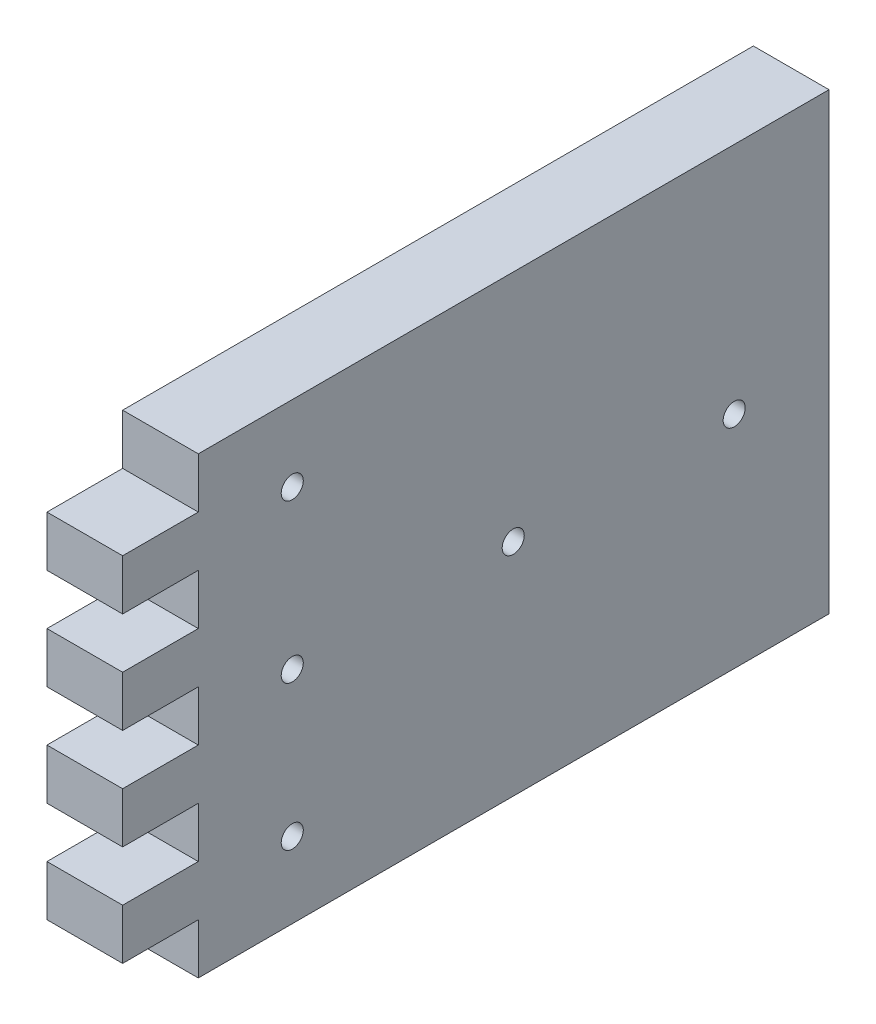
ISO-10303-21;
HEADER;
FILE_DESCRIPTION(('STEP AP214'),'2;1');
FILE_NAME('part.step','',(''),(''),'','','');
FILE_SCHEMA(('AUTOMOTIVE_DESIGN { 1 0 10303 214 1 1 1 1 }'));
ENDSEC;
DATA;
#1=APPLICATION_CONTEXT('core data for automotive mechanical design processes');
#2=APPLICATION_PROTOCOL_DEFINITION('international standard','automotive_design',2000,#1);
#3=PRODUCT_CONTEXT('',#1,'mechanical');
#4=PRODUCT('Part','Part','',(#3));
#5=PRODUCT_RELATED_PRODUCT_CATEGORY('part','',(#4));
#6=PRODUCT_DEFINITION_FORMATION('','',#4);
#7=PRODUCT_DEFINITION_CONTEXT('part definition',#1,'design');
#8=PRODUCT_DEFINITION('design','',#6,#7);
#9=PRODUCT_DEFINITION_SHAPE('','',#8);
#10=(LENGTH_UNIT() NAMED_UNIT(*) SI_UNIT(.MILLI.,.METRE.));
#11=(NAMED_UNIT(*) PLANE_ANGLE_UNIT() SI_UNIT($,.RADIAN.));
#12=(NAMED_UNIT(*) SI_UNIT($,.STERADIAN.) SOLID_ANGLE_UNIT());
#13=UNCERTAINTY_MEASURE_WITH_UNIT(LENGTH_MEASURE(1.E-05),#10,'distance_accuracy_value','');
#14=(GEOMETRIC_REPRESENTATION_CONTEXT(3) GLOBAL_UNCERTAINTY_ASSIGNED_CONTEXT((#13)) GLOBAL_UNIT_ASSIGNED_CONTEXT((#10,
#11,#12)) REPRESENTATION_CONTEXT('',''));
#15=CARTESIAN_POINT('',(0.,0.,0.));
#16=DIRECTION('',(0.,0.,1.));
#17=DIRECTION('',(1.,0.,0.));
#18=AXIS2_PLACEMENT_3D('',#15,#16,#17);
#19=CARTESIAN_POINT('',(19.05,114.3,-177.8635));
#20=DIRECTION('',(0.,0.,1.));
#21=DIRECTION('',(0.,-1.,0.));
#22=AXIS2_PLACEMENT_3D('',#19,#20,#21);
#23=PLANE('',#22);
#24=DIRECTION('',(0.,1.,0.));
#25=VECTOR('',#24,1.);
#26=CARTESIAN_POINT('',(0.,114.3,-177.8635));
#27=LINE('',#26,#25);
#28=CARTESIAN_POINT('',(0.,0.,-177.8635));
#29=VERTEX_POINT('',#28);
#30=CARTESIAN_POINT('',(0.,114.3,-177.8635));
#31=VERTEX_POINT('',#30);
#32=EDGE_CURVE('E203',#29,#31,#27,.T.);
#33=ORIENTED_EDGE('',*,*,#32,.T.);
#34=DIRECTION('',(-1.,0.,0.));
#35=VECTOR('',#34,1.);
#36=CARTESIAN_POINT('',(19.05,114.3,-177.8635));
#37=LINE('',#36,#35);
#38=CARTESIAN_POINT('',(19.05,114.3,-177.8635));
#39=VERTEX_POINT('',#38);
#40=EDGE_CURVE('E11',#39,#31,#37,.T.);
#41=ORIENTED_EDGE('',*,*,#40,.F.);
#42=DIRECTION('',(0.,1.,0.));
#43=VECTOR('',#42,1.);
#44=CARTESIAN_POINT('',(19.05,114.3,-177.8635));
#45=LINE('',#44,#43);
#46=CARTESIAN_POINT('',(19.05,0.,-177.8635));
#47=VERTEX_POINT('',#46);
#48=EDGE_CURVE('E242',#47,#39,#45,.T.);
#49=ORIENTED_EDGE('',*,*,#48,.F.);
#50=DIRECTION('',(-1.,0.,0.));
#51=VECTOR('',#50,1.);
#52=CARTESIAN_POINT('',(19.05,0.,-177.8635));
#53=LINE('',#52,#51);
#54=EDGE_CURVE('E199',#47,#29,#53,.T.);
#55=ORIENTED_EDGE('',*,*,#54,.T.);
#56=EDGE_LOOP('',(#33,#41,#49,#55));
#57=FACE_BOUND('',#56,.T.);
#58=ADVANCED_FACE('F35',(#57),#23,.F.);
#59=CARTESIAN_POINT('',(19.05,114.3,-19.05));
#60=DIRECTION('',(0.,-1.,0.));
#61=DIRECTION('',(0.,0.,-1.));
#62=AXIS2_PLACEMENT_3D('',#59,#60,#61);
#63=PLANE('',#62);
#64=DIRECTION('',(0.,0.,1.));
#65=VECTOR('',#64,1.);
#66=CARTESIAN_POINT('',(0.,114.3,-19.05));
#67=LINE('',#66,#65);
#68=CARTESIAN_POINT('',(0.,114.3,-19.05));
#69=VERTEX_POINT('',#68);
#70=EDGE_CURVE('E206',#31,#69,#67,.T.);
#71=ORIENTED_EDGE('',*,*,#70,.T.);
#72=DIRECTION('',(-1.,0.,0.));
#73=VECTOR('',#72,1.);
#74=CARTESIAN_POINT('',(19.05,114.3,-19.05));
#75=LINE('',#74,#73);
#76=CARTESIAN_POINT('',(19.05,114.3,-19.05));
#77=VERTEX_POINT('',#76);
#78=EDGE_CURVE('E43',#77,#69,#75,.T.);
#79=ORIENTED_EDGE('',*,*,#78,.F.);
#80=DIRECTION('',(0.,0.,1.));
#81=VECTOR('',#80,1.);
#82=CARTESIAN_POINT('',(19.05,114.3,-19.05));
#83=LINE('',#82,#81);
#84=EDGE_CURVE('E130',#39,#77,#83,.T.);
#85=ORIENTED_EDGE('',*,*,#84,.F.);
#86=ORIENTED_EDGE('',*,*,#40,.T.);
#87=EDGE_LOOP('',(#71,#79,#85,#86));
#88=FACE_BOUND('',#87,.T.);
#89=ADVANCED_FACE('F361',(#88),#63,.F.);
#90=CARTESIAN_POINT('',(19.05,114.3,-19.05));
#91=DIRECTION('',(0.,0.,-1.));
#92=DIRECTION('',(-1.,0.,0.));
#93=AXIS2_PLACEMENT_3D('',#90,#91,#92);
#94=PLANE('',#93);
#95=DIRECTION('',(0.,-1.,0.));
#96=VECTOR('',#95,1.);
#97=CARTESIAN_POINT('',(0.,114.3,-19.05));
#98=LINE('',#97,#96);
#99=CARTESIAN_POINT('',(0.,101.6,-19.05));
#100=VERTEX_POINT('',#99);
#101=EDGE_CURVE('E209',#69,#100,#98,.T.);
#102=ORIENTED_EDGE('',*,*,#101,.T.);
#103=DIRECTION('',(-1.,0.,0.));
#104=VECTOR('',#103,1.);
#105=CARTESIAN_POINT('',(19.05,101.6,-19.05));
#106=LINE('',#105,#104);
#107=CARTESIAN_POINT('',(19.05,101.6,-19.05));
#108=VERTEX_POINT('',#107);
#109=EDGE_CURVE('E285',#108,#100,#106,.T.);
#110=ORIENTED_EDGE('',*,*,#109,.F.);
#111=DIRECTION('',(0.,-1.,0.));
#112=VECTOR('',#111,1.);
#113=CARTESIAN_POINT('',(19.05,114.3,-19.05));
#114=LINE('',#113,#112);
#115=EDGE_CURVE('E293',#77,#108,#114,.T.);
#116=ORIENTED_EDGE('',*,*,#115,.F.);
#117=ORIENTED_EDGE('',*,*,#78,.T.);
#118=EDGE_LOOP('',(#102,#110,#116,#117));
#119=FACE_BOUND('',#118,.T.);
#120=ADVANCED_FACE('F291',(#119),#94,.F.);
#121=CARTESIAN_POINT('',(19.05,101.6,0.));
#122=DIRECTION('',(0.,-1.,0.));
#123=DIRECTION('',(0.,0.,-1.));
#124=AXIS2_PLACEMENT_3D('',#121,#122,#123);
#125=PLANE('',#124);
#126=DIRECTION('',(0.,0.,1.));
#127=VECTOR('',#126,1.);
#128=CARTESIAN_POINT('',(0.,101.6,0.));
#129=LINE('',#128,#127);
#130=CARTESIAN_POINT('',(0.,101.6,0.));
#131=VERTEX_POINT('',#130);
#132=EDGE_CURVE('E211',#100,#131,#129,.T.);
#133=ORIENTED_EDGE('',*,*,#132,.T.);
#134=DIRECTION('',(-1.,0.,0.));
#135=VECTOR('',#134,1.);
#136=CARTESIAN_POINT('',(19.05,101.6,0.));
#137=LINE('',#136,#135);
#138=CARTESIAN_POINT('',(19.05,101.6,0.));
#139=VERTEX_POINT('',#138);
#140=EDGE_CURVE('E282',#139,#131,#137,.T.);
#141=ORIENTED_EDGE('',*,*,#140,.F.);
#142=DIRECTION('',(0.,0.,1.));
#143=VECTOR('',#142,1.);
#144=CARTESIAN_POINT('',(19.05,101.6,0.));
#145=LINE('',#144,#143);
#146=EDGE_CURVE('E311',#108,#139,#145,.T.);
#147=ORIENTED_EDGE('',*,*,#146,.F.);
#148=ORIENTED_EDGE('',*,*,#109,.T.);
#149=EDGE_LOOP('',(#133,#141,#147,#148));
#150=FACE_BOUND('',#149,.T.);
#151=ADVANCED_FACE('F302',(#150),#125,.F.);
#152=CARTESIAN_POINT('',(19.05,88.9,0.));
#153=DIRECTION('',(0.,0.,-1.));
#154=DIRECTION('',(-1.,0.,0.));
#155=AXIS2_PLACEMENT_3D('',#152,#153,#154);
#156=PLANE('',#155);
#157=DIRECTION('',(0.,-1.,0.));
#158=VECTOR('',#157,1.);
#159=CARTESIAN_POINT('',(0.,88.9,0.));
#160=LINE('',#159,#158);
#161=CARTESIAN_POINT('',(0.,88.9,0.));
#162=VERTEX_POINT('',#161);
#163=EDGE_CURVE('E213',#131,#162,#160,.T.);
#164=ORIENTED_EDGE('',*,*,#163,.T.);
#165=DIRECTION('',(-1.,0.,0.));
#166=VECTOR('',#165,1.);
#167=CARTESIAN_POINT('',(19.05,88.9,0.));
#168=LINE('',#167,#166);
#169=CARTESIAN_POINT('',(19.05,88.9,0.));
#170=VERTEX_POINT('',#169);
#171=EDGE_CURVE('E279',#170,#162,#168,.T.);
#172=ORIENTED_EDGE('',*,*,#171,.F.);
#173=DIRECTION('',(0.,-1.,0.));
#174=VECTOR('',#173,1.);
#175=CARTESIAN_POINT('',(19.05,88.9,0.));
#176=LINE('',#175,#174);
#177=EDGE_CURVE('E308',#139,#170,#176,.T.);
#178=ORIENTED_EDGE('',*,*,#177,.F.);
#179=ORIENTED_EDGE('',*,*,#140,.T.);
#180=EDGE_LOOP('',(#164,#172,#178,#179));
#181=FACE_BOUND('',#180,.T.);
#182=ADVANCED_FACE('F306',(#181),#156,.F.);
#183=CARTESIAN_POINT('',(19.05,88.9,0.));
#184=DIRECTION('',(0.,1.,0.));
#185=DIRECTION('',(0.,0.,1.));
#186=AXIS2_PLACEMENT_3D('',#183,#184,#185);
#187=PLANE('',#186);
#188=DIRECTION('',(0.,0.,-1.));
#189=VECTOR('',#188,1.);
#190=CARTESIAN_POINT('',(0.,88.9,0.));
#191=LINE('',#190,#189);
#192=CARTESIAN_POINT('',(0.,88.9,-19.05));
#193=VERTEX_POINT('',#192);
#194=EDGE_CURVE('E215',#162,#193,#191,.T.);
#195=ORIENTED_EDGE('',*,*,#194,.T.);
#196=DIRECTION('',(-1.,0.,0.));
#197=VECTOR('',#196,1.);
#198=CARTESIAN_POINT('',(19.05,88.9,-19.05));
#199=LINE('',#198,#197);
#200=CARTESIAN_POINT('',(19.05,88.9,-19.05));
#201=VERTEX_POINT('',#200);
#202=EDGE_CURVE('E276',#201,#193,#199,.T.);
#203=ORIENTED_EDGE('',*,*,#202,.F.);
#204=DIRECTION('',(0.,0.,-1.));
#205=VECTOR('',#204,1.);
#206=CARTESIAN_POINT('',(19.05,88.9,0.));
#207=LINE('',#206,#205);
#208=EDGE_CURVE('E310',#170,#201,#207,.T.);
#209=ORIENTED_EDGE('',*,*,#208,.F.);
#210=ORIENTED_EDGE('',*,*,#171,.T.);
#211=EDGE_LOOP('',(#195,#203,#209,#210));
#212=FACE_BOUND('',#211,.T.);
#213=ADVANCED_FACE('F374',(#212),#187,.F.);
#214=CARTESIAN_POINT('',(19.05,88.9,-19.05));
#215=DIRECTION('',(0.,0.,-1.));
#216=DIRECTION('',(-1.,0.,0.));
#217=AXIS2_PLACEMENT_3D('',#214,#215,#216);
#218=PLANE('',#217);
#219=DIRECTION('',(0.,-1.,0.));
#220=VECTOR('',#219,1.);
#221=CARTESIAN_POINT('',(0.,88.9,-19.05));
#222=LINE('',#221,#220);
#223=CARTESIAN_POINT('',(0.,76.2,-19.05));
#224=VERTEX_POINT('',#223);
#225=EDGE_CURVE('E217',#193,#224,#222,.T.);
#226=ORIENTED_EDGE('',*,*,#225,.T.);
#227=DIRECTION('',(-1.,0.,0.));
#228=VECTOR('',#227,1.);
#229=CARTESIAN_POINT('',(19.05,76.2,-19.05));
#230=LINE('',#229,#228);
#231=CARTESIAN_POINT('',(19.05,76.2,-19.05));
#232=VERTEX_POINT('',#231);
#233=EDGE_CURVE('E273',#232,#224,#230,.T.);
#234=ORIENTED_EDGE('',*,*,#233,.F.);
#235=DIRECTION('',(0.,-1.,0.));
#236=VECTOR('',#235,1.);
#237=CARTESIAN_POINT('',(19.05,88.9,-19.05));
#238=LINE('',#237,#236);
#239=EDGE_CURVE('E313',#201,#232,#238,.T.);
#240=ORIENTED_EDGE('',*,*,#239,.F.);
#241=ORIENTED_EDGE('',*,*,#202,.T.);
#242=EDGE_LOOP('',(#226,#234,#240,#241));
#243=FACE_BOUND('',#242,.T.);
#244=ADVANCED_FACE('F377',(#243),#218,.F.);
#245=CARTESIAN_POINT('',(19.05,76.2,0.));
#246=DIRECTION('',(0.,-1.,0.));
#247=DIRECTION('',(0.,0.,-1.));
#248=AXIS2_PLACEMENT_3D('',#245,#246,#247);
#249=PLANE('',#248);
#250=DIRECTION('',(0.,0.,1.));
#251=VECTOR('',#250,1.);
#252=CARTESIAN_POINT('',(0.,76.2,0.));
#253=LINE('',#252,#251);
#254=CARTESIAN_POINT('',(0.,76.2,0.));
#255=VERTEX_POINT('',#254);
#256=EDGE_CURVE('E219',#224,#255,#253,.T.);
#257=ORIENTED_EDGE('',*,*,#256,.T.);
#258=DIRECTION('',(-1.,0.,0.));
#259=VECTOR('',#258,1.);
#260=CARTESIAN_POINT('',(19.05,76.2,0.));
#261=LINE('',#260,#259);
#262=CARTESIAN_POINT('',(19.05,76.2,0.));
#263=VERTEX_POINT('',#262);
#264=EDGE_CURVE('E270',#263,#255,#261,.T.);
#265=ORIENTED_EDGE('',*,*,#264,.F.);
#266=DIRECTION('',(0.,0.,1.));
#267=VECTOR('',#266,1.);
#268=CARTESIAN_POINT('',(19.05,76.2,0.));
#269=LINE('',#268,#267);
#270=EDGE_CURVE('E319',#232,#263,#269,.T.);
#271=ORIENTED_EDGE('',*,*,#270,.F.);
#272=ORIENTED_EDGE('',*,*,#233,.T.);
#273=EDGE_LOOP('',(#257,#265,#271,#272));
#274=FACE_BOUND('',#273,.T.);
#275=ADVANCED_FACE('F381',(#274),#249,.F.);
#276=CARTESIAN_POINT('',(19.05,63.5,0.));
#277=DIRECTION('',(0.,0.,-1.));
#278=DIRECTION('',(-1.,0.,0.));
#279=AXIS2_PLACEMENT_3D('',#276,#277,#278);
#280=PLANE('',#279);
#281=DIRECTION('',(0.,-1.,0.));
#282=VECTOR('',#281,1.);
#283=CARTESIAN_POINT('',(0.,63.5,0.));
#284=LINE('',#283,#282);
#285=CARTESIAN_POINT('',(0.,63.5,0.));
#286=VERTEX_POINT('',#285);
#287=EDGE_CURVE('E221',#255,#286,#284,.T.);
#288=ORIENTED_EDGE('',*,*,#287,.T.);
#289=DIRECTION('',(-1.,0.,0.));
#290=VECTOR('',#289,1.);
#291=CARTESIAN_POINT('',(19.05,63.5,0.));
#292=LINE('',#291,#290);
#293=CARTESIAN_POINT('',(19.05,63.5,0.));
#294=VERTEX_POINT('',#293);
#295=EDGE_CURVE('E267',#294,#286,#292,.T.);
#296=ORIENTED_EDGE('',*,*,#295,.F.);
#297=DIRECTION('',(0.,-1.,0.));
#298=VECTOR('',#297,1.);
#299=CARTESIAN_POINT('',(19.05,63.5,0.));
#300=LINE('',#299,#298);
#301=EDGE_CURVE('E321',#263,#294,#300,.T.);
#302=ORIENTED_EDGE('',*,*,#301,.F.);
#303=ORIENTED_EDGE('',*,*,#264,.T.);
#304=EDGE_LOOP('',(#288,#296,#302,#303));
#305=FACE_BOUND('',#304,.T.);
#306=ADVANCED_FACE('F385',(#305),#280,.F.);
#307=CARTESIAN_POINT('',(19.05,63.5,0.));
#308=DIRECTION('',(0.,1.,0.));
#309=DIRECTION('',(0.,0.,1.));
#310=AXIS2_PLACEMENT_3D('',#307,#308,#309);
#311=PLANE('',#310);
#312=DIRECTION('',(0.,0.,-1.));
#313=VECTOR('',#312,1.);
#314=CARTESIAN_POINT('',(0.,63.5,0.));
#315=LINE('',#314,#313);
#316=CARTESIAN_POINT('',(0.,63.5,-19.05));
#317=VERTEX_POINT('',#316);
#318=EDGE_CURVE('E223',#286,#317,#315,.T.);
#319=ORIENTED_EDGE('',*,*,#318,.T.);
#320=DIRECTION('',(-1.,0.,0.));
#321=VECTOR('',#320,1.);
#322=CARTESIAN_POINT('',(19.05,63.5,-19.05));
#323=LINE('',#322,#321);
#324=CARTESIAN_POINT('',(19.05,63.5,-19.05));
#325=VERTEX_POINT('',#324);
#326=EDGE_CURVE('E264',#325,#317,#323,.T.);
#327=ORIENTED_EDGE('',*,*,#326,.F.);
#328=DIRECTION('',(0.,0.,-1.));
#329=VECTOR('',#328,1.);
#330=CARTESIAN_POINT('',(19.05,63.5,0.));
#331=LINE('',#330,#329);
#332=EDGE_CURVE('E323',#294,#325,#331,.T.);
#333=ORIENTED_EDGE('',*,*,#332,.F.);
#334=ORIENTED_EDGE('',*,*,#295,.T.);
#335=EDGE_LOOP('',(#319,#327,#333,#334));
#336=FACE_BOUND('',#335,.T.);
#337=ADVANCED_FACE('F389',(#336),#311,.F.);
#338=CARTESIAN_POINT('',(19.05,63.5,-19.05));
#339=DIRECTION('',(0.,0.,-1.));
#340=DIRECTION('',(-1.,0.,0.));
#341=AXIS2_PLACEMENT_3D('',#338,#339,#340);
#342=PLANE('',#341);
#343=DIRECTION('',(0.,-1.,0.));
#344=VECTOR('',#343,1.);
#345=CARTESIAN_POINT('',(0.,63.5,-19.05));
#346=LINE('',#345,#344);
#347=CARTESIAN_POINT('',(0.,50.8,-19.05));
#348=VERTEX_POINT('',#347);
#349=EDGE_CURVE('E225',#317,#348,#346,.T.);
#350=ORIENTED_EDGE('',*,*,#349,.T.);
#351=DIRECTION('',(-1.,0.,0.));
#352=VECTOR('',#351,1.);
#353=CARTESIAN_POINT('',(19.05,50.8,-19.05));
#354=LINE('',#353,#352);
#355=CARTESIAN_POINT('',(19.05,50.8,-19.05));
#356=VERTEX_POINT('',#355);
#357=EDGE_CURVE('E261',#356,#348,#354,.T.);
#358=ORIENTED_EDGE('',*,*,#357,.F.);
#359=DIRECTION('',(0.,-1.,0.));
#360=VECTOR('',#359,1.);
#361=CARTESIAN_POINT('',(19.05,63.5,-19.05));
#362=LINE('',#361,#360);
#363=EDGE_CURVE('E325',#325,#356,#362,.T.);
#364=ORIENTED_EDGE('',*,*,#363,.F.);
#365=ORIENTED_EDGE('',*,*,#326,.T.);
#366=EDGE_LOOP('',(#350,#358,#364,#365));
#367=FACE_BOUND('',#366,.T.);
#368=ADVANCED_FACE('F393',(#367),#342,.F.);
#369=CARTESIAN_POINT('',(19.05,50.8,0.));
#370=DIRECTION('',(0.,-1.,0.));
#371=DIRECTION('',(0.,0.,-1.));
#372=AXIS2_PLACEMENT_3D('',#369,#370,#371);
#373=PLANE('',#372);
#374=DIRECTION('',(0.,0.,1.));
#375=VECTOR('',#374,1.);
#376=CARTESIAN_POINT('',(0.,50.8,0.));
#377=LINE('',#376,#375);
#378=CARTESIAN_POINT('',(0.,50.8,0.));
#379=VERTEX_POINT('',#378);
#380=EDGE_CURVE('E227',#348,#379,#377,.T.);
#381=ORIENTED_EDGE('',*,*,#380,.T.);
#382=DIRECTION('',(-1.,0.,0.));
#383=VECTOR('',#382,1.);
#384=CARTESIAN_POINT('',(19.05,50.8,0.));
#385=LINE('',#384,#383);
#386=CARTESIAN_POINT('',(19.05,50.8,0.));
#387=VERTEX_POINT('',#386);
#388=EDGE_CURVE('E258',#387,#379,#385,.T.);
#389=ORIENTED_EDGE('',*,*,#388,.F.);
#390=DIRECTION('',(0.,0.,1.));
#391=VECTOR('',#390,1.);
#392=CARTESIAN_POINT('',(19.05,50.8,0.));
#393=LINE('',#392,#391);
#394=EDGE_CURVE('E327',#356,#387,#393,.T.);
#395=ORIENTED_EDGE('',*,*,#394,.F.);
#396=ORIENTED_EDGE('',*,*,#357,.T.);
#397=EDGE_LOOP('',(#381,#389,#395,#396));
#398=FACE_BOUND('',#397,.T.);
#399=ADVANCED_FACE('F397',(#398),#373,.F.);
#400=CARTESIAN_POINT('',(19.05,38.1,0.));
#401=DIRECTION('',(0.,0.,-1.));
#402=DIRECTION('',(-1.,0.,0.));
#403=AXIS2_PLACEMENT_3D('',#400,#401,#402);
#404=PLANE('',#403);
#405=DIRECTION('',(0.,-1.,0.));
#406=VECTOR('',#405,1.);
#407=CARTESIAN_POINT('',(0.,38.1,0.));
#408=LINE('',#407,#406);
#409=CARTESIAN_POINT('',(0.,38.1,0.));
#410=VERTEX_POINT('',#409);
#411=EDGE_CURVE('E229',#379,#410,#408,.T.);
#412=ORIENTED_EDGE('',*,*,#411,.T.);
#413=DIRECTION('',(-1.,0.,0.));
#414=VECTOR('',#413,1.);
#415=CARTESIAN_POINT('',(19.05,38.1,0.));
#416=LINE('',#415,#414);
#417=CARTESIAN_POINT('',(19.05,38.1,0.));
#418=VERTEX_POINT('',#417);
#419=EDGE_CURVE('E255',#418,#410,#416,.T.);
#420=ORIENTED_EDGE('',*,*,#419,.F.);
#421=DIRECTION('',(0.,-1.,0.));
#422=VECTOR('',#421,1.);
#423=CARTESIAN_POINT('',(19.05,38.1,0.));
#424=LINE('',#423,#422);
#425=EDGE_CURVE('E329',#387,#418,#424,.T.);
#426=ORIENTED_EDGE('',*,*,#425,.F.);
#427=ORIENTED_EDGE('',*,*,#388,.T.);
#428=EDGE_LOOP('',(#412,#420,#426,#427));
#429=FACE_BOUND('',#428,.T.);
#430=ADVANCED_FACE('F401',(#429),#404,.F.);
#431=CARTESIAN_POINT('',(19.05,38.1,0.));
#432=DIRECTION('',(0.,1.,0.));
#433=DIRECTION('',(0.,0.,1.));
#434=AXIS2_PLACEMENT_3D('',#431,#432,#433);
#435=PLANE('',#434);
#436=DIRECTION('',(0.,0.,-1.));
#437=VECTOR('',#436,1.);
#438=CARTESIAN_POINT('',(0.,38.1,0.));
#439=LINE('',#438,#437);
#440=CARTESIAN_POINT('',(0.,38.1,-19.05));
#441=VERTEX_POINT('',#440);
#442=EDGE_CURVE('E231',#410,#441,#439,.T.);
#443=ORIENTED_EDGE('',*,*,#442,.T.);
#444=DIRECTION('',(-1.,0.,0.));
#445=VECTOR('',#444,1.);
#446=CARTESIAN_POINT('',(19.05,38.1,-19.05));
#447=LINE('',#446,#445);
#448=CARTESIAN_POINT('',(19.05,38.1,-19.05));
#449=VERTEX_POINT('',#448);
#450=EDGE_CURVE('E252',#449,#441,#447,.T.);
#451=ORIENTED_EDGE('',*,*,#450,.F.);
#452=DIRECTION('',(0.,0.,-1.));
#453=VECTOR('',#452,1.);
#454=CARTESIAN_POINT('',(19.05,38.1,0.));
#455=LINE('',#454,#453);
#456=EDGE_CURVE('E331',#418,#449,#455,.T.);
#457=ORIENTED_EDGE('',*,*,#456,.F.);
#458=ORIENTED_EDGE('',*,*,#419,.T.);
#459=EDGE_LOOP('',(#443,#451,#457,#458));
#460=FACE_BOUND('',#459,.T.);
#461=ADVANCED_FACE('F405',(#460),#435,.F.);
#462=CARTESIAN_POINT('',(19.05,38.1,-19.05));
#463=DIRECTION('',(0.,0.,-1.));
#464=DIRECTION('',(-1.,0.,0.));
#465=AXIS2_PLACEMENT_3D('',#462,#463,#464);
#466=PLANE('',#465);
#467=DIRECTION('',(0.,-1.,0.));
#468=VECTOR('',#467,1.);
#469=CARTESIAN_POINT('',(0.,38.1,-19.05));
#470=LINE('',#469,#468);
#471=CARTESIAN_POINT('',(0.,25.4,-19.05));
#472=VERTEX_POINT('',#471);
#473=EDGE_CURVE('E233',#441,#472,#470,.T.);
#474=ORIENTED_EDGE('',*,*,#473,.T.);
#475=DIRECTION('',(-1.,0.,0.));
#476=VECTOR('',#475,1.);
#477=CARTESIAN_POINT('',(19.05,25.4,-19.05));
#478=LINE('',#477,#476);
#479=CARTESIAN_POINT('',(19.05,25.4,-19.05));
#480=VERTEX_POINT('',#479);
#481=EDGE_CURVE('E249',#480,#472,#478,.T.);
#482=ORIENTED_EDGE('',*,*,#481,.F.);
#483=DIRECTION('',(0.,-1.,0.));
#484=VECTOR('',#483,1.);
#485=CARTESIAN_POINT('',(19.05,38.1,-19.05));
#486=LINE('',#485,#484);
#487=EDGE_CURVE('E333',#449,#480,#486,.T.);
#488=ORIENTED_EDGE('',*,*,#487,.F.);
#489=ORIENTED_EDGE('',*,*,#450,.T.);
#490=EDGE_LOOP('',(#474,#482,#488,#489));
#491=FACE_BOUND('',#490,.T.);
#492=ADVANCED_FACE('F409',(#491),#466,.F.);
#493=CARTESIAN_POINT('',(19.05,25.4,0.));
#494=DIRECTION('',(0.,-1.,0.));
#495=DIRECTION('',(0.,0.,-1.));
#496=AXIS2_PLACEMENT_3D('',#493,#494,#495);
#497=PLANE('',#496);
#498=DIRECTION('',(0.,0.,1.));
#499=VECTOR('',#498,1.);
#500=CARTESIAN_POINT('',(0.,25.4,0.));
#501=LINE('',#500,#499);
#502=CARTESIAN_POINT('',(0.,25.4,0.));
#503=VERTEX_POINT('',#502);
#504=EDGE_CURVE('E235',#472,#503,#501,.T.);
#505=ORIENTED_EDGE('',*,*,#504,.T.);
#506=DIRECTION('',(-1.,0.,0.));
#507=VECTOR('',#506,1.);
#508=CARTESIAN_POINT('',(19.05,25.4,0.));
#509=LINE('',#508,#507);
#510=CARTESIAN_POINT('',(19.05,25.4,0.));
#511=VERTEX_POINT('',#510);
#512=EDGE_CURVE('E246',#511,#503,#509,.T.);
#513=ORIENTED_EDGE('',*,*,#512,.F.);
#514=DIRECTION('',(0.,0.,1.));
#515=VECTOR('',#514,1.);
#516=CARTESIAN_POINT('',(19.05,25.4,0.));
#517=LINE('',#516,#515);
#518=EDGE_CURVE('E335',#480,#511,#517,.T.);
#519=ORIENTED_EDGE('',*,*,#518,.F.);
#520=ORIENTED_EDGE('',*,*,#481,.T.);
#521=EDGE_LOOP('',(#505,#513,#519,#520));
#522=FACE_BOUND('',#521,.T.);
#523=ADVANCED_FACE('F341',(#522),#497,.F.);
#524=CARTESIAN_POINT('',(19.05,12.7,0.));
#525=DIRECTION('',(0.,0.,-1.));
#526=DIRECTION('',(-1.,0.,0.));
#527=AXIS2_PLACEMENT_3D('',#524,#525,#526);
#528=PLANE('',#527);
#529=DIRECTION('',(0.,-1.,0.));
#530=VECTOR('',#529,1.);
#531=CARTESIAN_POINT('',(0.,12.7,0.));
#532=LINE('',#531,#530);
#533=CARTESIAN_POINT('',(0.,12.7,0.));
#534=VERTEX_POINT('',#533);
#535=EDGE_CURVE('E237',#503,#534,#532,.T.);
#536=ORIENTED_EDGE('',*,*,#535,.T.);
#537=DIRECTION('',(-1.,0.,0.));
#538=VECTOR('',#537,1.);
#539=CARTESIAN_POINT('',(19.05,12.7,0.));
#540=LINE('',#539,#538);
#541=CARTESIAN_POINT('',(19.05,12.7,0.));
#542=VERTEX_POINT('',#541);
#543=EDGE_CURVE('E194',#542,#534,#540,.T.);
#544=ORIENTED_EDGE('',*,*,#543,.F.);
#545=DIRECTION('',(0.,-1.,0.));
#546=VECTOR('',#545,1.);
#547=CARTESIAN_POINT('',(19.05,12.7,0.));
#548=LINE('',#547,#546);
#549=EDGE_CURVE('E185',#511,#542,#548,.T.);
#550=ORIENTED_EDGE('',*,*,#549,.F.);
#551=ORIENTED_EDGE('',*,*,#512,.T.);
#552=EDGE_LOOP('',(#536,#544,#550,#551));
#553=FACE_BOUND('',#552,.T.);
#554=ADVANCED_FACE('F345',(#553),#528,.F.);
#555=CARTESIAN_POINT('',(19.05,12.7,0.));
#556=DIRECTION('',(0.,1.,0.));
#557=DIRECTION('',(0.,0.,1.));
#558=AXIS2_PLACEMENT_3D('',#555,#556,#557);
#559=PLANE('',#558);
#560=DIRECTION('',(0.,0.,-1.));
#561=VECTOR('',#560,1.);
#562=CARTESIAN_POINT('',(0.,12.7,0.));
#563=LINE('',#562,#561);
#564=CARTESIAN_POINT('',(0.,12.7,-19.05));
#565=VERTEX_POINT('',#564);
#566=EDGE_CURVE('E193',#534,#565,#563,.T.);
#567=ORIENTED_EDGE('',*,*,#566,.T.);
#568=DIRECTION('',(-1.,0.,0.));
#569=VECTOR('',#568,1.);
#570=CARTESIAN_POINT('',(19.05,12.7,-19.05));
#571=LINE('',#570,#569);
#572=CARTESIAN_POINT('',(19.05,12.7,-19.05));
#573=VERTEX_POINT('',#572);
#574=EDGE_CURVE('E190',#573,#565,#571,.T.);
#575=ORIENTED_EDGE('',*,*,#574,.F.);
#576=DIRECTION('',(0.,0.,-1.));
#577=VECTOR('',#576,1.);
#578=CARTESIAN_POINT('',(19.05,12.7,0.));
#579=LINE('',#578,#577);
#580=EDGE_CURVE('E179',#542,#573,#579,.T.);
#581=ORIENTED_EDGE('',*,*,#580,.F.);
#582=ORIENTED_EDGE('',*,*,#543,.T.);
#583=EDGE_LOOP('',(#567,#575,#581,#582));
#584=FACE_BOUND('',#583,.T.);
#585=ADVANCED_FACE('F191',(#584),#559,.F.);
#586=CARTESIAN_POINT('',(19.05,0.,-19.05));
#587=DIRECTION('',(0.,0.,-1.));
#588=DIRECTION('',(0.,1.,0.));
#589=AXIS2_PLACEMENT_3D('',#586,#587,#588);
#590=PLANE('',#589);
#591=DIRECTION('',(0.,-1.,0.));
#592=VECTOR('',#591,1.);
#593=CARTESIAN_POINT('',(0.,0.,-19.05));
#594=LINE('',#593,#592);
#595=CARTESIAN_POINT('',(0.,0.,-19.05));
#596=VERTEX_POINT('',#595);
#597=EDGE_CURVE('E116',#565,#596,#594,.T.);
#598=ORIENTED_EDGE('',*,*,#597,.T.);
#599=DIRECTION('',(-1.,0.,0.));
#600=VECTOR('',#599,1.);
#601=CARTESIAN_POINT('',(19.05,0.,-19.05));
#602=LINE('',#601,#600);
#603=CARTESIAN_POINT('',(19.05,0.,-19.05));
#604=VERTEX_POINT('',#603);
#605=EDGE_CURVE('E195',#604,#596,#602,.T.);
#606=ORIENTED_EDGE('',*,*,#605,.F.);
#607=DIRECTION('',(0.,-1.,0.));
#608=VECTOR('',#607,1.);
#609=CARTESIAN_POINT('',(19.05,0.,-19.05));
#610=LINE('',#609,#608);
#611=EDGE_CURVE('E183',#573,#604,#610,.T.);
#612=ORIENTED_EDGE('',*,*,#611,.F.);
#613=ORIENTED_EDGE('',*,*,#574,.T.);
#614=EDGE_LOOP('',(#598,#606,#612,#613));
#615=FACE_BOUND('',#614,.T.);
#616=ADVANCED_FACE('F197',(#615),#590,.F.);
#617=CARTESIAN_POINT('',(19.05,0.,-19.05));
#618=DIRECTION('',(0.,1.,0.));
#619=DIRECTION('',(0.,0.,1.));
#620=AXIS2_PLACEMENT_3D('',#617,#618,#619);
#621=PLANE('',#620);
#622=DIRECTION('',(0.,0.,-1.));
#623=VECTOR('',#622,1.);
#624=CARTESIAN_POINT('',(0.,0.,-19.05));
#625=LINE('',#624,#623);
#626=EDGE_CURVE('E122',#596,#29,#625,.T.);
#627=ORIENTED_EDGE('',*,*,#626,.T.);
#628=ORIENTED_EDGE('',*,*,#54,.F.);
#629=DIRECTION('',(0.,0.,-1.));
#630=VECTOR('',#629,1.);
#631=CARTESIAN_POINT('',(19.05,0.,-19.05));
#632=LINE('',#631,#630);
#633=EDGE_CURVE('E51',#604,#47,#632,.T.);
#634=ORIENTED_EDGE('',*,*,#633,.F.);
#635=ORIENTED_EDGE('',*,*,#605,.T.);
#636=EDGE_LOOP('',(#627,#628,#634,#635));
#637=FACE_BOUND('',#636,.T.);
#638=ADVANCED_FACE('F349',(#637),#621,.F.);
#639=CARTESIAN_POINT('',(19.05,0.,0.));
#640=DIRECTION('',(1.,0.,0.));
#641=DIRECTION('',(0.,0.,-1.));
#642=AXIS2_PLACEMENT_3D('',#639,#640,#641);
#643=PLANE('',#642);
#644=CARTESIAN_POINT('',(19.05,55.499,-153.9875));
#645=DIRECTION('',(1.,0.,0.));
#646=DIRECTION('',(0.,0.,-1.));
#647=AXIS2_PLACEMENT_3D('',#644,#645,#646);
#648=CIRCLE('',#647,2.778125);
#649=CARTESIAN_POINT('',(19.05,55.499,-156.765625));
#650=VERTEX_POINT('',#649);
#651=EDGE_CURVE('E505',#650,#650,#648,.T.);
#652=ORIENTED_EDGE('',*,*,#651,.F.);
#653=EDGE_LOOP('',(#652));
#654=FACE_BOUND('',#653,.T.);
#655=CARTESIAN_POINT('',(19.05,55.499,-98.3488));
#656=DIRECTION('',(1.,0.,0.));
#657=DIRECTION('',(0.,0.,-1.));
#658=AXIS2_PLACEMENT_3D('',#655,#656,#657);
#659=CIRCLE('',#658,2.778125);
#660=CARTESIAN_POINT('',(19.05,55.499,-101.126925));
#661=VERTEX_POINT('',#660);
#662=EDGE_CURVE('E507',#661,#661,#659,.T.);
#663=ORIENTED_EDGE('',*,*,#662,.F.);
#664=EDGE_LOOP('',(#663));
#665=FACE_BOUND('',#664,.T.);
#666=CARTESIAN_POINT('',(19.05,55.499,-42.7101));
#667=DIRECTION('',(1.,0.,0.));
#668=DIRECTION('',(0.,0.,-1.));
#669=AXIS2_PLACEMENT_3D('',#666,#667,#668);
#670=CIRCLE('',#669,2.778125);
#671=CARTESIAN_POINT('',(19.05,55.499,-45.488225));
#672=VERTEX_POINT('',#671);
#673=EDGE_CURVE('E515',#672,#672,#670,.T.);
#674=ORIENTED_EDGE('',*,*,#673,.F.);
#675=EDGE_LOOP('',(#674));
#676=FACE_BOUND('',#675,.T.);
#677=CARTESIAN_POINT('',(19.05,95.25,-42.7101));
#678=DIRECTION('',(1.,0.,0.));
#679=DIRECTION('',(0.,0.,-1.));
#680=AXIS2_PLACEMENT_3D('',#677,#678,#679);
#681=CIRCLE('',#680,2.77812499999999);
#682=CARTESIAN_POINT('',(19.05,95.25,-45.488225));
#683=VERTEX_POINT('',#682);
#684=EDGE_CURVE('E521',#683,#683,#681,.T.);
#685=ORIENTED_EDGE('',*,*,#684,.F.);
#686=EDGE_LOOP('',(#685));
#687=FACE_BOUND('',#686,.T.);
#688=CARTESIAN_POINT('',(19.05,19.05,-42.7101));
#689=DIRECTION('',(1.,0.,0.));
#690=DIRECTION('',(0.,0.,-1.));
#691=AXIS2_PLACEMENT_3D('',#688,#689,#690);
#692=CIRCLE('',#691,2.778125);
#693=CARTESIAN_POINT('',(19.05,19.05,-45.488225));
#694=VERTEX_POINT('',#693);
#695=EDGE_CURVE('E527',#694,#694,#692,.T.);
#696=ORIENTED_EDGE('',*,*,#695,.F.);
#697=EDGE_LOOP('',(#696));
#698=FACE_BOUND('',#697,.T.);
#699=ORIENTED_EDGE('',*,*,#48,.T.);
#700=ORIENTED_EDGE('',*,*,#84,.T.);
#701=ORIENTED_EDGE('',*,*,#115,.T.);
#702=ORIENTED_EDGE('',*,*,#146,.T.);
#703=ORIENTED_EDGE('',*,*,#177,.T.);
#704=ORIENTED_EDGE('',*,*,#208,.T.);
#705=ORIENTED_EDGE('',*,*,#239,.T.);
#706=ORIENTED_EDGE('',*,*,#270,.T.);
#707=ORIENTED_EDGE('',*,*,#301,.T.);
#708=ORIENTED_EDGE('',*,*,#332,.T.);
#709=ORIENTED_EDGE('',*,*,#363,.T.);
#710=ORIENTED_EDGE('',*,*,#394,.T.);
#711=ORIENTED_EDGE('',*,*,#425,.T.);
#712=ORIENTED_EDGE('',*,*,#456,.T.);
#713=ORIENTED_EDGE('',*,*,#487,.T.);
#714=ORIENTED_EDGE('',*,*,#518,.T.);
#715=ORIENTED_EDGE('',*,*,#549,.T.);
#716=ORIENTED_EDGE('',*,*,#580,.T.);
#717=ORIENTED_EDGE('',*,*,#611,.T.);
#718=ORIENTED_EDGE('',*,*,#633,.T.);
#719=EDGE_LOOP('',(#699,#700,#701,#702,#703,#704,#705,#706,#707,#708,#709,#710,#711,#712,#713,
#714,#715,#716,#717,#718));
#720=FACE_BOUND('',#719,.T.);
#721=ADVANCED_FACE('F181',(#654,#665,#676,#687,#698,#720),#643,.T.);
#722=CARTESIAN_POINT('',(0.,0.,0.));
#723=DIRECTION('',(1.,0.,0.));
#724=DIRECTION('',(0.,0.,-1.));
#725=AXIS2_PLACEMENT_3D('',#722,#723,#724);
#726=PLANE('',#725);
#727=CARTESIAN_POINT('',(0.,55.499,-153.9875));
#728=DIRECTION('',(1.,0.,0.));
#729=DIRECTION('',(0.,0.,-1.));
#730=AXIS2_PLACEMENT_3D('',#727,#728,#729);
#731=CIRCLE('',#730,2.778125);
#732=CARTESIAN_POINT('',(0.,55.499,-156.765625));
#733=VERTEX_POINT('',#732);
#734=EDGE_CURVE('E502',#733,#733,#731,.T.);
#735=ORIENTED_EDGE('',*,*,#734,.T.);
#736=EDGE_LOOP('',(#735));
#737=FACE_BOUND('',#736,.T.);
#738=CARTESIAN_POINT('',(0.,55.499,-98.3488));
#739=DIRECTION('',(1.,0.,0.));
#740=DIRECTION('',(0.,0.,-1.));
#741=AXIS2_PLACEMENT_3D('',#738,#739,#740);
#742=CIRCLE('',#741,2.778125);
#743=CARTESIAN_POINT('',(0.,55.499,-101.126925));
#744=VERTEX_POINT('',#743);
#745=EDGE_CURVE('E512',#744,#744,#742,.T.);
#746=ORIENTED_EDGE('',*,*,#745,.T.);
#747=EDGE_LOOP('',(#746));
#748=FACE_BOUND('',#747,.T.);
#749=CARTESIAN_POINT('',(0.,55.499,-42.7101));
#750=DIRECTION('',(1.,0.,0.));
#751=DIRECTION('',(0.,0.,-1.));
#752=AXIS2_PLACEMENT_3D('',#749,#750,#751);
#753=CIRCLE('',#752,2.778125);
#754=CARTESIAN_POINT('',(0.,55.499,-45.488225));
#755=VERTEX_POINT('',#754);
#756=EDGE_CURVE('E518',#755,#755,#753,.T.);
#757=ORIENTED_EDGE('',*,*,#756,.T.);
#758=EDGE_LOOP('',(#757));
#759=FACE_BOUND('',#758,.T.);
#760=CARTESIAN_POINT('',(0.,95.25,-42.7101));
#761=DIRECTION('',(1.,0.,0.));
#762=DIRECTION('',(0.,0.,-1.));
#763=AXIS2_PLACEMENT_3D('',#760,#761,#762);
#764=CIRCLE('',#763,2.77812499999999);
#765=CARTESIAN_POINT('',(0.,95.25,-45.488225));
#766=VERTEX_POINT('',#765);
#767=EDGE_CURVE('E524',#766,#766,#764,.T.);
#768=ORIENTED_EDGE('',*,*,#767,.T.);
#769=EDGE_LOOP('',(#768));
#770=FACE_BOUND('',#769,.T.);
#771=CARTESIAN_POINT('',(0.,19.05,-42.7101));
#772=DIRECTION('',(1.,0.,0.));
#773=DIRECTION('',(0.,0.,-1.));
#774=AXIS2_PLACEMENT_3D('',#771,#772,#773);
#775=CIRCLE('',#774,2.778125);
#776=CARTESIAN_POINT('',(0.,19.05,-45.488225));
#777=VERTEX_POINT('',#776);
#778=EDGE_CURVE('E207',#777,#777,#775,.T.);
#779=ORIENTED_EDGE('',*,*,#778,.T.);
#780=EDGE_LOOP('',(#779));
#781=FACE_BOUND('',#780,.T.);
#782=ORIENTED_EDGE('',*,*,#32,.F.);
#783=ORIENTED_EDGE('',*,*,#626,.F.);
#784=ORIENTED_EDGE('',*,*,#597,.F.);
#785=ORIENTED_EDGE('',*,*,#566,.F.);
#786=ORIENTED_EDGE('',*,*,#535,.F.);
#787=ORIENTED_EDGE('',*,*,#504,.F.);
#788=ORIENTED_EDGE('',*,*,#473,.F.);
#789=ORIENTED_EDGE('',*,*,#442,.F.);
#790=ORIENTED_EDGE('',*,*,#411,.F.);
#791=ORIENTED_EDGE('',*,*,#380,.F.);
#792=ORIENTED_EDGE('',*,*,#349,.F.);
#793=ORIENTED_EDGE('',*,*,#318,.F.);
#794=ORIENTED_EDGE('',*,*,#287,.F.);
#795=ORIENTED_EDGE('',*,*,#256,.F.);
#796=ORIENTED_EDGE('',*,*,#225,.F.);
#797=ORIENTED_EDGE('',*,*,#194,.F.);
#798=ORIENTED_EDGE('',*,*,#163,.F.);
#799=ORIENTED_EDGE('',*,*,#132,.F.);
#800=ORIENTED_EDGE('',*,*,#101,.F.);
#801=ORIENTED_EDGE('',*,*,#70,.F.);
#802=EDGE_LOOP('',(#782,#783,#784,#785,#786,#787,#788,#789,#790,#791,#792,#793,#794,#795,#796,
#797,#798,#799,#800,#801));
#803=FACE_BOUND('',#802,.T.);
#804=ADVANCED_FACE('F297',(#737,#748,#759,#770,#781,#803),#726,.F.);
#805=CARTESIAN_POINT('',(19.05,19.05,-42.7101));
#806=DIRECTION('',(1.,0.,0.));
#807=DIRECTION('',(0.,0.,-1.));
#808=AXIS2_PLACEMENT_3D('',#805,#806,#807);
#809=CYLINDRICAL_SURFACE('',#808,2.778125);
#810=ORIENTED_EDGE('',*,*,#778,.F.);
#811=EDGE_LOOP('',(#810));
#812=FACE_BOUND('',#811,.T.);
#813=ORIENTED_EDGE('',*,*,#695,.T.);
#814=EDGE_LOOP('',(#813));
#815=FACE_BOUND('',#814,.T.);
#816=ADVANCED_FACE('F446',(#812,#815),#809,.F.);
#817=CARTESIAN_POINT('',(19.05,95.25,-42.7101));
#818=DIRECTION('',(1.,0.,0.));
#819=DIRECTION('',(0.,0.,-1.));
#820=AXIS2_PLACEMENT_3D('',#817,#818,#819);
#821=CYLINDRICAL_SURFACE('',#820,2.77812499999999);
#822=ORIENTED_EDGE('',*,*,#767,.F.);
#823=EDGE_LOOP('',(#822));
#824=FACE_BOUND('',#823,.T.);
#825=ORIENTED_EDGE('',*,*,#684,.T.);
#826=EDGE_LOOP('',(#825));
#827=FACE_BOUND('',#826,.T.);
#828=ADVANCED_FACE('F455',(#824,#827),#821,.F.);
#829=CARTESIAN_POINT('',(19.05,55.499,-42.7101));
#830=DIRECTION('',(1.,0.,0.));
#831=DIRECTION('',(0.,0.,-1.));
#832=AXIS2_PLACEMENT_3D('',#829,#830,#831);
#833=CYLINDRICAL_SURFACE('',#832,2.778125);
#834=ORIENTED_EDGE('',*,*,#756,.F.);
#835=EDGE_LOOP('',(#834));
#836=FACE_BOUND('',#835,.T.);
#837=ORIENTED_EDGE('',*,*,#673,.T.);
#838=EDGE_LOOP('',(#837));
#839=FACE_BOUND('',#838,.T.);
#840=ADVANCED_FACE('F465',(#836,#839),#833,.F.);
#841=CARTESIAN_POINT('',(19.05,55.499,-98.3488));
#842=DIRECTION('',(1.,0.,0.));
#843=DIRECTION('',(0.,0.,-1.));
#844=AXIS2_PLACEMENT_3D('',#841,#842,#843);
#845=CYLINDRICAL_SURFACE('',#844,2.778125);
#846=ORIENTED_EDGE('',*,*,#745,.F.);
#847=EDGE_LOOP('',(#846));
#848=FACE_BOUND('',#847,.T.);
#849=ORIENTED_EDGE('',*,*,#662,.T.);
#850=EDGE_LOOP('',(#849));
#851=FACE_BOUND('',#850,.T.);
#852=ADVANCED_FACE('F475',(#848,#851),#845,.F.);
#853=CARTESIAN_POINT('',(19.05,55.499,-153.9875));
#854=DIRECTION('',(1.,0.,0.));
#855=DIRECTION('',(0.,0.,-1.));
#856=AXIS2_PLACEMENT_3D('',#853,#854,#855);
#857=CYLINDRICAL_SURFACE('',#856,2.778125);
#858=ORIENTED_EDGE('',*,*,#734,.F.);
#859=EDGE_LOOP('',(#858));
#860=FACE_BOUND('',#859,.T.);
#861=ORIENTED_EDGE('',*,*,#651,.T.);
#862=EDGE_LOOP('',(#861));
#863=FACE_BOUND('',#862,.T.);
#864=ADVANCED_FACE('F485',(#860,#863),#857,.F.);
#865=CLOSED_SHELL('',(#58,#89,#120,#151,#182,#213,#244,#275,#306,#337,#368,#399,#430,#461,#492,
#523,#554,#585,#616,#638,#721,#804,#816,#828,#840,#852,#864));
#866=MANIFOLD_SOLID_BREP('B2',#865);
#867=ADVANCED_BREP_SHAPE_REPRESENTATION('',(#18,#866),#14);
#868=SHAPE_DEFINITION_REPRESENTATION(#9,#867);
ENDSEC;
END-ISO-10303-21;
